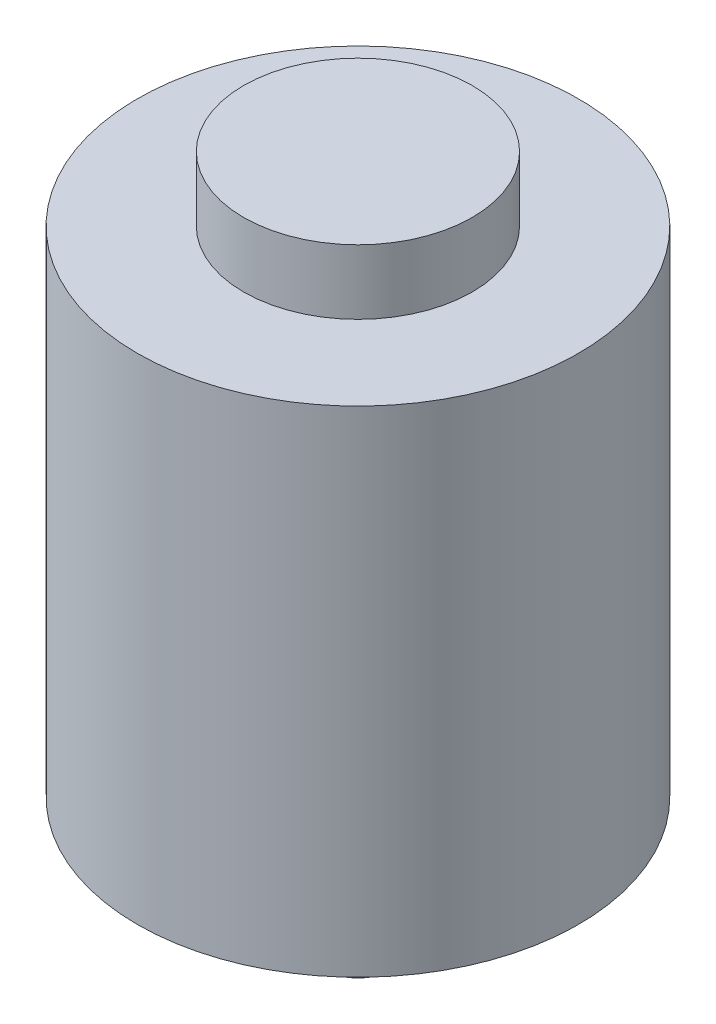
ISO-10303-21;
HEADER;
FILE_DESCRIPTION(('STEP AP214'),'2;1');
FILE_NAME('part.step','',(''),(''),'','','');
FILE_SCHEMA(('AUTOMOTIVE_DESIGN { 1 0 10303 214 1 1 1 1 }'));
ENDSEC;
DATA;
#1=APPLICATION_CONTEXT('core data for automotive mechanical design processes');
#2=APPLICATION_PROTOCOL_DEFINITION('international standard','automotive_design',2000,#1);
#3=PRODUCT_CONTEXT('',#1,'mechanical');
#4=PRODUCT('Part','Part','',(#3));
#5=PRODUCT_RELATED_PRODUCT_CATEGORY('part','',(#4));
#6=PRODUCT_DEFINITION_FORMATION('','',#4);
#7=PRODUCT_DEFINITION_CONTEXT('part definition',#1,'design');
#8=PRODUCT_DEFINITION('design','',#6,#7);
#9=PRODUCT_DEFINITION_SHAPE('','',#8);
#10=(LENGTH_UNIT() NAMED_UNIT(*) SI_UNIT(.MILLI.,.METRE.));
#11=(NAMED_UNIT(*) PLANE_ANGLE_UNIT() SI_UNIT($,.RADIAN.));
#12=(NAMED_UNIT(*) SI_UNIT($,.STERADIAN.) SOLID_ANGLE_UNIT());
#13=UNCERTAINTY_MEASURE_WITH_UNIT(LENGTH_MEASURE(1.E-05),#10,'distance_accuracy_value','');
#14=(GEOMETRIC_REPRESENTATION_CONTEXT(3) GLOBAL_UNCERTAINTY_ASSIGNED_CONTEXT((#13)) GLOBAL_UNIT_ASSIGNED_CONTEXT((#10,
#11,#12)) REPRESENTATION_CONTEXT('',''));
#15=CARTESIAN_POINT('',(0.,0.,0.));
#16=DIRECTION('',(0.,0.,1.));
#17=DIRECTION('',(1.,0.,0.));
#18=AXIS2_PLACEMENT_3D('',#15,#16,#17);
#19=CARTESIAN_POINT('',(0.,-10.,0.));
#20=DIRECTION('',(0.,1.,0.));
#21=DIRECTION('',(0.,0.,1.));
#22=AXIS2_PLACEMENT_3D('',#19,#20,#21);
#23=CYLINDRICAL_SURFACE('',#22,1.);
#24=CARTESIAN_POINT('',(0.,-3.,0.));
#25=DIRECTION('',(0.,-1.,0.));
#26=DIRECTION('',(0.,0.,-1.));
#27=AXIS2_PLACEMENT_3D('',#24,#25,#26);
#28=CIRCLE('',#27,1.);
#29=CARTESIAN_POINT('',(0.,-3.,-1.));
#30=VERTEX_POINT('',#29);
#31=EDGE_CURVE('E45',#30,#30,#28,.T.);
#32=ORIENTED_EDGE('',*,*,#31,.T.);
#33=EDGE_LOOP('',(#32));
#34=FACE_BOUND('',#33,.T.);
#35=CARTESIAN_POINT('',(0.,-6.,0.));
#36=DIRECTION('',(0.,-1.,0.));
#37=DIRECTION('',(0.,0.,-1.));
#38=AXIS2_PLACEMENT_3D('',#35,#36,#37);
#39=CIRCLE('',#38,1.);
#40=CARTESIAN_POINT('',(0.,-6.,-1.));
#41=VERTEX_POINT('',#40);
#42=EDGE_CURVE('E10',#41,#41,#39,.T.);
#43=ORIENTED_EDGE('',*,*,#42,.F.);
#44=EDGE_LOOP('',(#43));
#45=FACE_BOUND('',#44,.T.);
#46=ADVANCED_FACE('F37',(#34,#45),#23,.T.);
#47=CARTESIAN_POINT('',(0.,38.3,0.));
#48=DIRECTION('',(0.,-1.,0.));
#49=DIRECTION('',(0.,0.,-1.));
#50=AXIS2_PLACEMENT_3D('',#47,#48,#49);
#51=CYLINDRICAL_SURFACE('',#50,17.075);
#52=CARTESIAN_POINT('',(0.,38.3,0.));
#53=DIRECTION('',(0.,1.,0.));
#54=DIRECTION('',(0.,0.,1.));
#55=AXIS2_PLACEMENT_3D('',#52,#53,#54);
#56=CIRCLE('',#55,17.075);
#57=CARTESIAN_POINT('',(0.,38.3,17.075));
#58=VERTEX_POINT('',#57);
#59=EDGE_CURVE('E75',#58,#58,#56,.T.);
#60=ORIENTED_EDGE('',*,*,#59,.F.);
#61=EDGE_LOOP('',(#60));
#62=FACE_BOUND('',#61,.T.);
#63=CARTESIAN_POINT('',(0.,0.,0.));
#64=DIRECTION('',(0.,1.,0.));
#65=DIRECTION('',(0.,0.,1.));
#66=AXIS2_PLACEMENT_3D('',#63,#64,#65);
#67=CIRCLE('',#66,17.075);
#68=CARTESIAN_POINT('',(0.,0.,17.075));
#69=VERTEX_POINT('',#68);
#70=EDGE_CURVE('E71',#69,#69,#67,.T.);
#71=ORIENTED_EDGE('',*,*,#70,.T.);
#72=EDGE_LOOP('',(#71));
#73=FACE_BOUND('',#72,.T.);
#74=ADVANCED_FACE('F39',(#62,#73),#51,.T.);
#75=CARTESIAN_POINT('',(0.,38.3,0.));
#76=DIRECTION('',(0.,1.,0.));
#77=DIRECTION('',(0.,0.,1.));
#78=AXIS2_PLACEMENT_3D('',#75,#76,#77);
#79=PLANE('',#78);
#80=CARTESIAN_POINT('',(0.,38.3,0.));
#81=DIRECTION('',(0.,1.,0.));
#82=DIRECTION('',(0.,0.,1.));
#83=AXIS2_PLACEMENT_3D('',#80,#81,#82);
#84=CIRCLE('',#83,8.85);
#85=CARTESIAN_POINT('',(0.,38.3,8.85));
#86=VERTEX_POINT('',#85);
#87=EDGE_CURVE('E56',#86,#86,#84,.T.);
#88=ORIENTED_EDGE('',*,*,#87,.F.);
#89=EDGE_LOOP('',(#88));
#90=FACE_BOUND('',#89,.T.);
#91=ORIENTED_EDGE('',*,*,#59,.T.);
#92=EDGE_LOOP('',(#91));
#93=FACE_BOUND('',#92,.T.);
#94=ADVANCED_FACE('F86',(#90,#93),#79,.T.);
#95=CARTESIAN_POINT('',(0.,0.,0.));
#96=DIRECTION('',(0.,1.,0.));
#97=DIRECTION('',(0.,0.,1.));
#98=AXIS2_PLACEMENT_3D('',#95,#96,#97);
#99=PLANE('',#98);
#100=CARTESIAN_POINT('',(0.,0.,0.));
#101=DIRECTION('',(0.,-1.,0.));
#102=DIRECTION('',(0.,0.,-1.));
#103=AXIS2_PLACEMENT_3D('',#100,#101,#102);
#104=CIRCLE('',#103,4.);
#105=CARTESIAN_POINT('',(0.,0.,-4.));
#106=VERTEX_POINT('',#105);
#107=EDGE_CURVE('E50',#106,#106,#104,.T.);
#108=ORIENTED_EDGE('',*,*,#107,.F.);
#109=EDGE_LOOP('',(#108));
#110=FACE_BOUND('',#109,.T.);
#111=ORIENTED_EDGE('',*,*,#70,.F.);
#112=EDGE_LOOP('',(#111));
#113=FACE_BOUND('',#112,.T.);
#114=ADVANCED_FACE('F83',(#110,#113),#99,.F.);
#115=CARTESIAN_POINT('',(0.,43.3,0.));
#116=DIRECTION('',(0.,-1.,0.));
#117=DIRECTION('',(0.,0.,-1.));
#118=AXIS2_PLACEMENT_3D('',#115,#116,#117);
#119=CYLINDRICAL_SURFACE('',#118,8.85);
#120=CARTESIAN_POINT('',(0.,43.3,0.));
#121=DIRECTION('',(0.,1.,0.));
#122=DIRECTION('',(0.,0.,1.));
#123=AXIS2_PLACEMENT_3D('',#120,#121,#122);
#124=CIRCLE('',#123,8.85);
#125=CARTESIAN_POINT('',(0.,43.3,8.85));
#126=VERTEX_POINT('',#125);
#127=EDGE_CURVE('E65',#126,#126,#124,.T.);
#128=ORIENTED_EDGE('',*,*,#127,.F.);
#129=EDGE_LOOP('',(#128));
#130=FACE_BOUND('',#129,.T.);
#131=ORIENTED_EDGE('',*,*,#87,.T.);
#132=EDGE_LOOP('',(#131));
#133=FACE_BOUND('',#132,.T.);
#134=ADVANCED_FACE('F85',(#130,#133),#119,.T.);
#135=CARTESIAN_POINT('',(0.,43.3,0.));
#136=DIRECTION('',(0.,1.,0.));
#137=DIRECTION('',(0.,0.,1.));
#138=AXIS2_PLACEMENT_3D('',#135,#136,#137);
#139=PLANE('',#138);
#140=ORIENTED_EDGE('',*,*,#127,.T.);
#141=EDGE_LOOP('',(#140));
#142=FACE_BOUND('',#141,.T.);
#143=ADVANCED_FACE('F92',(#142),#139,.T.);
#144=CARTESIAN_POINT('',(0.,-3.,0.));
#145=DIRECTION('',(0.,1.,0.));
#146=DIRECTION('',(0.,0.,1.));
#147=AXIS2_PLACEMENT_3D('',#144,#145,#146);
#148=CYLINDRICAL_SURFACE('',#147,4.);
#149=CARTESIAN_POINT('',(0.,-3.,0.));
#150=DIRECTION('',(0.,-1.,0.));
#151=DIRECTION('',(0.,0.,-1.));
#152=AXIS2_PLACEMENT_3D('',#149,#150,#151);
#153=CIRCLE('',#152,4.);
#154=CARTESIAN_POINT('',(0.,-3.,-4.));
#155=VERTEX_POINT('',#154);
#156=EDGE_CURVE('E62',#155,#155,#153,.T.);
#157=ORIENTED_EDGE('',*,*,#156,.F.);
#158=EDGE_LOOP('',(#157));
#159=FACE_BOUND('',#158,.T.);
#160=ORIENTED_EDGE('',*,*,#107,.T.);
#161=EDGE_LOOP('',(#160));
#162=FACE_BOUND('',#161,.T.);
#163=ADVANCED_FACE('F113',(#159,#162),#148,.T.);
#164=CARTESIAN_POINT('',(0.,-3.,0.));
#165=DIRECTION('',(0.,-1.,0.));
#166=DIRECTION('',(0.,0.,-1.));
#167=AXIS2_PLACEMENT_3D('',#164,#165,#166);
#168=PLANE('',#167);
#169=ORIENTED_EDGE('',*,*,#31,.F.);
#170=EDGE_LOOP('',(#169));
#171=FACE_BOUND('',#170,.T.);
#172=ORIENTED_EDGE('',*,*,#156,.T.);
#173=EDGE_LOOP('',(#172));
#174=FACE_BOUND('',#173,.T.);
#175=ADVANCED_FACE('F109',(#171,#174),#168,.T.);
#176=CARTESIAN_POINT('',(0.,-6.,0.));
#177=DIRECTION('',(0.,-1.,0.));
#178=DIRECTION('',(0.,0.,-1.));
#179=AXIS2_PLACEMENT_3D('',#176,#177,#178);
#180=CYLINDRICAL_SURFACE('',#179,3.);
#181=CARTESIAN_POINT('',(0.,-6.,0.));
#182=DIRECTION('',(0.,-1.,0.));
#183=DIRECTION('',(0.,0.,-1.));
#184=AXIS2_PLACEMENT_3D('',#181,#182,#183);
#185=CIRCLE('',#184,3.);
#186=CARTESIAN_POINT('',(0.,-6.,-3.));
#187=VERTEX_POINT('',#186);
#188=EDGE_CURVE('E66',#187,#187,#185,.T.);
#189=ORIENTED_EDGE('',*,*,#188,.T.);
#190=EDGE_LOOP('',(#189));
#191=FACE_BOUND('',#190,.T.);
#192=CARTESIAN_POINT('',(0.,-10.,0.));
#193=DIRECTION('',(0.,-1.,0.));
#194=DIRECTION('',(0.,0.,-1.));
#195=AXIS2_PLACEMENT_3D('',#192,#193,#194);
#196=CIRCLE('',#195,3.);
#197=CARTESIAN_POINT('',(0.,-10.,-3.));
#198=VERTEX_POINT('',#197);
#199=EDGE_CURVE('E60',#198,#198,#196,.T.);
#200=ORIENTED_EDGE('',*,*,#199,.F.);
#201=EDGE_LOOP('',(#200));
#202=FACE_BOUND('',#201,.T.);
#203=ADVANCED_FACE('F112',(#191,#202),#180,.T.);
#204=CARTESIAN_POINT('',(0.,-6.,0.));
#205=DIRECTION('',(0.,-1.,0.));
#206=DIRECTION('',(0.,0.,-1.));
#207=AXIS2_PLACEMENT_3D('',#204,#205,#206);
#208=PLANE('',#207);
#209=ORIENTED_EDGE('',*,*,#42,.T.);
#210=EDGE_LOOP('',(#209));
#211=FACE_BOUND('',#210,.T.);
#212=ORIENTED_EDGE('',*,*,#188,.F.);
#213=EDGE_LOOP('',(#212));
#214=FACE_BOUND('',#213,.T.);
#215=ADVANCED_FACE('F143',(#211,#214),#208,.F.);
#216=CARTESIAN_POINT('',(0.,-10.,0.));
#217=DIRECTION('',(0.,-1.,0.));
#218=DIRECTION('',(0.,0.,-1.));
#219=AXIS2_PLACEMENT_3D('',#216,#217,#218);
#220=PLANE('',#219);
#221=ORIENTED_EDGE('',*,*,#199,.T.);
#222=EDGE_LOOP('',(#221));
#223=FACE_BOUND('',#222,.T.);
#224=ADVANCED_FACE('F107',(#223),#220,.T.);
#225=CLOSED_SHELL('',(#46,#74,#94,#114,#134,#143,#163,#175,#203,#215,#224));
#226=MANIFOLD_SOLID_BREP('B2',#225);
#227=ADVANCED_BREP_SHAPE_REPRESENTATION('',(#18,#226),#14);
#228=SHAPE_DEFINITION_REPRESENTATION(#9,#227);
ENDSEC;
END-ISO-10303-21;
